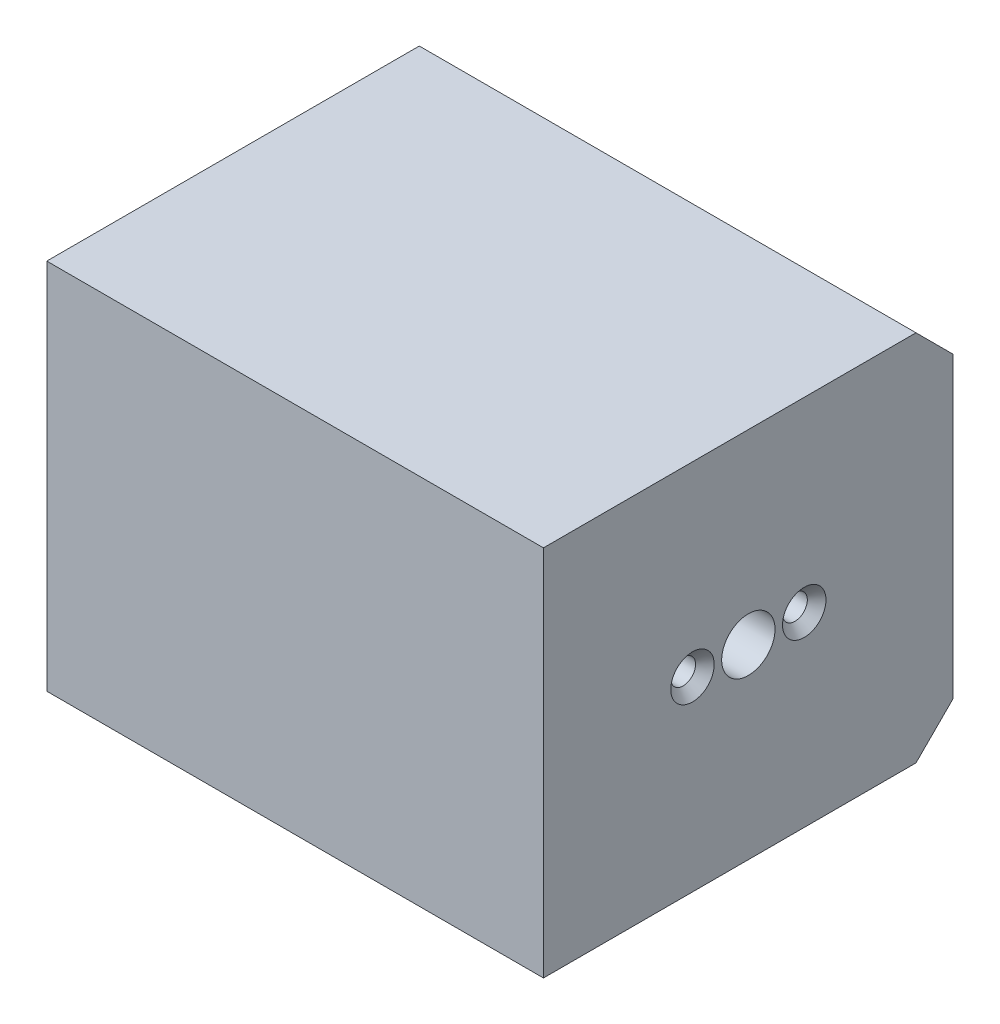
ISO-10303-21;
HEADER;
FILE_DESCRIPTION(('STEP AP214'),'2;1');
FILE_NAME('part.step','',(''),(''),'','','');
FILE_SCHEMA(('AUTOMOTIVE_DESIGN { 1 0 10303 214 1 1 1 1 }'));
ENDSEC;
DATA;
#1=APPLICATION_CONTEXT('core data for automotive mechanical design processes');
#2=APPLICATION_PROTOCOL_DEFINITION('international standard','automotive_design',2000,#1);
#3=PRODUCT_CONTEXT('',#1,'mechanical');
#4=PRODUCT('Part','Part','',(#3));
#5=PRODUCT_RELATED_PRODUCT_CATEGORY('part','',(#4));
#6=PRODUCT_DEFINITION_FORMATION('','',#4);
#7=PRODUCT_DEFINITION_CONTEXT('part definition',#1,'design');
#8=PRODUCT_DEFINITION('design','',#6,#7);
#9=PRODUCT_DEFINITION_SHAPE('','',#8);
#10=(LENGTH_UNIT() NAMED_UNIT(*) SI_UNIT(.MILLI.,.METRE.));
#11=(NAMED_UNIT(*) PLANE_ANGLE_UNIT() SI_UNIT($,.RADIAN.));
#12=(NAMED_UNIT(*) SI_UNIT($,.STERADIAN.) SOLID_ANGLE_UNIT());
#13=UNCERTAINTY_MEASURE_WITH_UNIT(LENGTH_MEASURE(1.E-05),#10,'distance_accuracy_value','');
#14=(GEOMETRIC_REPRESENTATION_CONTEXT(3) GLOBAL_UNCERTAINTY_ASSIGNED_CONTEXT((#13)) GLOBAL_UNIT_ASSIGNED_CONTEXT((#10,
#11,#12)) REPRESENTATION_CONTEXT('',''));
#15=CARTESIAN_POINT('',(0.,0.,0.));
#16=DIRECTION('',(0.,0.,1.));
#17=DIRECTION('',(1.,0.,0.));
#18=AXIS2_PLACEMENT_3D('',#15,#16,#17);
#19=CARTESIAN_POINT('',(0.,15.,-10.));
#20=DIRECTION('',(0.,-1.,0.));
#21=DIRECTION('',(0.,0.,-1.));
#22=AXIS2_PLACEMENT_3D('',#19,#20,#21);
#23=PLANE('',#22);
#24=DIRECTION('',(0.,0.,1.));
#25=VECTOR('',#24,1.);
#26=CARTESIAN_POINT('',(0.,15.,-10.));
#27=LINE('',#26,#25);
#28=CARTESIAN_POINT('',(0.,15.,-7.));
#29=VERTEX_POINT('',#28);
#30=CARTESIAN_POINT('',(0.,15.,23.));
#31=VERTEX_POINT('',#30);
#32=EDGE_CURVE('E174',#29,#31,#27,.T.);
#33=ORIENTED_EDGE('',*,*,#32,.F.);
#34=DIRECTION('',(-1.,0.,0.));
#35=VECTOR('',#34,1.);
#36=CARTESIAN_POINT('',(0.,15.,-7.));
#37=LINE('',#36,#35);
#38=CARTESIAN_POINT('',(-40.,15.,-6.99999999999999));
#39=VERTEX_POINT('',#38);
#40=EDGE_CURVE('E56',#29,#39,#37,.T.);
#41=ORIENTED_EDGE('',*,*,#40,.T.);
#42=DIRECTION('',(0.,0.,1.));
#43=VECTOR('',#42,1.);
#44=CARTESIAN_POINT('',(-40.,15.,-10.));
#45=LINE('',#44,#43);
#46=CARTESIAN_POINT('',(-40.,15.,23.));
#47=VERTEX_POINT('',#46);
#48=EDGE_CURVE('E173',#39,#47,#45,.T.);
#49=ORIENTED_EDGE('',*,*,#48,.T.);
#50=DIRECTION('',(1.,0.,0.));
#51=VECTOR('',#50,1.);
#52=CARTESIAN_POINT('',(0.,15.,23.));
#53=LINE('',#52,#51);
#54=EDGE_CURVE('E123',#47,#31,#53,.T.);
#55=ORIENTED_EDGE('',*,*,#54,.T.);
#56=EDGE_LOOP('',(#33,#41,#49,#55));
#57=FACE_BOUND('',#56,.T.);
#58=ADVANCED_FACE('F33',(#57),#23,.F.);
#59=CARTESIAN_POINT('',(0.,0.,-10.));
#60=DIRECTION('',(-1.,0.,0.));
#61=DIRECTION('',(0.,0.,1.));
#62=AXIS2_PLACEMENT_3D('',#59,#60,#61);
#63=PLANE('',#62);
#64=CARTESIAN_POINT('',(0.,0.,11.));
#65=DIRECTION('',(1.,0.,0.));
#66=DIRECTION('',(0.,0.,-1.));
#67=AXIS2_PLACEMENT_3D('',#64,#65,#66);
#68=CIRCLE('',#67,1.75);
#69=CARTESIAN_POINT('',(0.,0.,9.25));
#70=VERTEX_POINT('',#69);
#71=EDGE_CURVE('E286',#70,#70,#68,.T.);
#72=ORIENTED_EDGE('',*,*,#71,.F.);
#73=EDGE_LOOP('',(#72));
#74=FACE_BOUND('',#73,.T.);
#75=CARTESIAN_POINT('',(0.,0.,2.));
#76=DIRECTION('',(1.,0.,0.));
#77=DIRECTION('',(0.,0.,-1.));
#78=AXIS2_PLACEMENT_3D('',#75,#76,#77);
#79=CIRCLE('',#78,1.75);
#80=CARTESIAN_POINT('',(0.,0.,0.25));
#81=VERTEX_POINT('',#80);
#82=EDGE_CURVE('E190',#81,#81,#79,.T.);
#83=ORIENTED_EDGE('',*,*,#82,.F.);
#84=EDGE_LOOP('',(#83));
#85=FACE_BOUND('',#84,.T.);
#86=CARTESIAN_POINT('',(0.,0.,6.5));
#87=DIRECTION('',(-1.,0.,0.));
#88=DIRECTION('',(0.,0.,1.));
#89=AXIS2_PLACEMENT_3D('',#86,#87,#88);
#90=CIRCLE('',#89,2.15);
#91=CARTESIAN_POINT('',(0.,0.,8.65));
#92=VERTEX_POINT('',#91);
#93=EDGE_CURVE('E146',#92,#92,#90,.T.);
#94=ORIENTED_EDGE('',*,*,#93,.T.);
#95=EDGE_LOOP('',(#94));
#96=FACE_BOUND('',#95,.T.);
#97=DIRECTION('',(0.,-1.,0.));
#98=VECTOR('',#97,1.);
#99=CARTESIAN_POINT('',(0.,0.,-10.));
#100=LINE('',#99,#98);
#101=CARTESIAN_POINT('',(0.,12.,-10.));
#102=VERTEX_POINT('',#101);
#103=CARTESIAN_POINT('',(0.,-12.,-10.));
#104=VERTEX_POINT('',#103);
#105=EDGE_CURVE('E170',#102,#104,#100,.T.);
#106=ORIENTED_EDGE('',*,*,#105,.F.);
#107=DIRECTION('',(0.,-0.707106781186547,-0.707106781186548));
#108=VECTOR('',#107,1.);
#109=CARTESIAN_POINT('',(0.,12.,-10.));
#110=LINE('',#109,#108);
#111=EDGE_CURVE('E198',#102,#29,#110,.F.);
#112=ORIENTED_EDGE('',*,*,#111,.T.);
#113=ORIENTED_EDGE('',*,*,#32,.T.);
#114=DIRECTION('',(0.,-1.,0.));
#115=VECTOR('',#114,1.);
#116=CARTESIAN_POINT('',(0.,0.,23.));
#117=LINE('',#116,#115);
#118=CARTESIAN_POINT('',(0.,-15.,23.));
#119=VERTEX_POINT('',#118);
#120=EDGE_CURVE('E165',#31,#119,#117,.T.);
#121=ORIENTED_EDGE('',*,*,#120,.T.);
#122=DIRECTION('',(0.,0.,1.));
#123=VECTOR('',#122,1.);
#124=CARTESIAN_POINT('',(0.,-15.,-10.));
#125=LINE('',#124,#123);
#126=CARTESIAN_POINT('',(0.,-15.,-7.));
#127=VERTEX_POINT('',#126);
#128=EDGE_CURVE('E177',#127,#119,#125,.T.);
#129=ORIENTED_EDGE('',*,*,#128,.F.);
#130=DIRECTION('',(0.,0.707106781186548,-0.707106781186547));
#131=VECTOR('',#130,1.);
#132=CARTESIAN_POINT('',(0.,-15.,-7.));
#133=LINE('',#132,#131);
#134=EDGE_CURVE('E196',#127,#104,#133,.T.);
#135=ORIENTED_EDGE('',*,*,#134,.T.);
#136=EDGE_LOOP('',(#106,#112,#113,#121,#129,#135));
#137=FACE_BOUND('',#136,.T.);
#138=ADVANCED_FACE('F213',(#74,#85,#96,#137),#63,.F.);
#139=CARTESIAN_POINT('',(0.,-15.,-10.));
#140=DIRECTION('',(0.,-1.,0.));
#141=DIRECTION('',(0.,0.,-1.));
#142=AXIS2_PLACEMENT_3D('',#139,#140,#141);
#143=PLANE('',#142);
#144=DIRECTION('',(0.,0.,1.));
#145=VECTOR('',#144,1.);
#146=CARTESIAN_POINT('',(-40.,-15.,-10.));
#147=LINE('',#146,#145);
#148=CARTESIAN_POINT('',(-40.,-15.,-7.));
#149=VERTEX_POINT('',#148);
#150=CARTESIAN_POINT('',(-40.,-15.,23.));
#151=VERTEX_POINT('',#150);
#152=EDGE_CURVE('E179',#149,#151,#147,.T.);
#153=ORIENTED_EDGE('',*,*,#152,.F.);
#154=DIRECTION('',(1.,0.,0.));
#155=VECTOR('',#154,1.);
#156=CARTESIAN_POINT('',(0.,-15.,-7.));
#157=LINE('',#156,#155);
#158=EDGE_CURVE('E11',#149,#127,#157,.T.);
#159=ORIENTED_EDGE('',*,*,#158,.T.);
#160=ORIENTED_EDGE('',*,*,#128,.T.);
#161=DIRECTION('',(1.,0.,0.));
#162=VECTOR('',#161,1.);
#163=CARTESIAN_POINT('',(0.,-15.,23.));
#164=LINE('',#163,#162);
#165=EDGE_CURVE('E162',#151,#119,#164,.T.);
#166=ORIENTED_EDGE('',*,*,#165,.F.);
#167=EDGE_LOOP('',(#153,#159,#160,#166));
#168=FACE_BOUND('',#167,.T.);
#169=ADVANCED_FACE('F221',(#168),#143,.T.);
#170=CARTESIAN_POINT('',(-40.,0.,-10.));
#171=DIRECTION('',(-1.,0.,0.));
#172=DIRECTION('',(0.,0.,1.));
#173=AXIS2_PLACEMENT_3D('',#170,#171,#172);
#174=PLANE('',#173);
#175=DIRECTION('',(0.,-1.,0.));
#176=VECTOR('',#175,1.);
#177=CARTESIAN_POINT('',(-40.,0.,13.));
#178=LINE('',#177,#176);
#179=CARTESIAN_POINT('',(-40.,5.5,13.));
#180=VERTEX_POINT('',#179);
#181=CARTESIAN_POINT('',(-40.,-5.5,13.));
#182=VERTEX_POINT('',#181);
#183=EDGE_CURVE('E137',#180,#182,#178,.T.);
#184=ORIENTED_EDGE('',*,*,#183,.T.);
#185=DIRECTION('',(0.,0.,-1.));
#186=VECTOR('',#185,1.);
#187=CARTESIAN_POINT('',(-40.,-5.5,13.));
#188=LINE('',#187,#186);
#189=CARTESIAN_POINT('',(-40.,-5.5,0.));
#190=VERTEX_POINT('',#189);
#191=EDGE_CURVE('E153',#182,#190,#188,.T.);
#192=ORIENTED_EDGE('',*,*,#191,.T.);
#193=DIRECTION('',(0.,-1.,0.));
#194=VECTOR('',#193,1.);
#195=CARTESIAN_POINT('',(-40.,0.,0.));
#196=LINE('',#195,#194);
#197=CARTESIAN_POINT('',(-40.,5.5,0.));
#198=VERTEX_POINT('',#197);
#199=EDGE_CURVE('E148',#198,#190,#196,.T.);
#200=ORIENTED_EDGE('',*,*,#199,.F.);
#201=DIRECTION('',(0.,0.,-1.));
#202=VECTOR('',#201,1.);
#203=CARTESIAN_POINT('',(-40.,5.5,13.));
#204=LINE('',#203,#202);
#205=EDGE_CURVE('E124',#180,#198,#204,.T.);
#206=ORIENTED_EDGE('',*,*,#205,.F.);
#207=EDGE_LOOP('',(#184,#192,#200,#206));
#208=FACE_BOUND('',#207,.T.);
#209=ORIENTED_EDGE('',*,*,#48,.F.);
#210=DIRECTION('',(0.,0.707106781186547,0.707106781186548));
#211=VECTOR('',#210,1.);
#212=CARTESIAN_POINT('',(-40.,6.00000000000002,-16.));
#213=LINE('',#212,#211);
#214=CARTESIAN_POINT('',(-40.,12.,-10.));
#215=VERTEX_POINT('',#214);
#216=EDGE_CURVE('E41',#39,#215,#213,.F.);
#217=ORIENTED_EDGE('',*,*,#216,.T.);
#218=DIRECTION('',(0.,-1.,0.));
#219=VECTOR('',#218,1.);
#220=CARTESIAN_POINT('',(-40.,0.,-10.));
#221=LINE('',#220,#219);
#222=CARTESIAN_POINT('',(-40.,-12.,-10.));
#223=VERTEX_POINT('',#222);
#224=EDGE_CURVE('E168',#215,#223,#221,.T.);
#225=ORIENTED_EDGE('',*,*,#224,.T.);
#226=DIRECTION('',(0.,-0.707106781186548,0.707106781186547));
#227=VECTOR('',#226,1.);
#228=CARTESIAN_POINT('',(-40.,-5.99999999999998,-16.));
#229=LINE('',#228,#227);
#230=EDGE_CURVE('E48',#223,#149,#229,.T.);
#231=ORIENTED_EDGE('',*,*,#230,.T.);
#232=ORIENTED_EDGE('',*,*,#152,.T.);
#233=DIRECTION('',(0.,-1.,0.));
#234=VECTOR('',#233,1.);
#235=CARTESIAN_POINT('',(-40.,0.,23.));
#236=LINE('',#235,#234);
#237=EDGE_CURVE('E159',#47,#151,#236,.T.);
#238=ORIENTED_EDGE('',*,*,#237,.F.);
#239=EDGE_LOOP('',(#209,#217,#225,#231,#232,#238));
#240=FACE_BOUND('',#239,.T.);
#241=ADVANCED_FACE('F203',(#208,#240),#174,.T.);
#242=CARTESIAN_POINT('',(0.,0.,-10.));
#243=DIRECTION('',(0.,0.,1.));
#244=DIRECTION('',(1.,0.,0.));
#245=AXIS2_PLACEMENT_3D('',#242,#243,#244);
#246=PLANE('',#245);
#247=ORIENTED_EDGE('',*,*,#224,.F.);
#248=DIRECTION('',(1.,0.,0.));
#249=VECTOR('',#248,1.);
#250=CARTESIAN_POINT('',(0.,12.,-10.));
#251=LINE('',#250,#249);
#252=EDGE_CURVE('E193',#215,#102,#251,.T.);
#253=ORIENTED_EDGE('',*,*,#252,.T.);
#254=ORIENTED_EDGE('',*,*,#105,.T.);
#255=DIRECTION('',(-1.,0.,0.));
#256=VECTOR('',#255,1.);
#257=CARTESIAN_POINT('',(-40.,-12.,-10.));
#258=LINE('',#257,#256);
#259=EDGE_CURVE('E176',#104,#223,#258,.T.);
#260=ORIENTED_EDGE('',*,*,#259,.T.);
#261=EDGE_LOOP('',(#247,#253,#254,#260));
#262=FACE_BOUND('',#261,.T.);
#263=ADVANCED_FACE('F208',(#262),#246,.F.);
#264=CARTESIAN_POINT('',(0.,0.,23.));
#265=DIRECTION('',(0.,0.,1.));
#266=DIRECTION('',(1.,0.,0.));
#267=AXIS2_PLACEMENT_3D('',#264,#265,#266);
#268=PLANE('',#267);
#269=ORIENTED_EDGE('',*,*,#54,.F.);
#270=ORIENTED_EDGE('',*,*,#237,.T.);
#271=ORIENTED_EDGE('',*,*,#165,.T.);
#272=ORIENTED_EDGE('',*,*,#120,.F.);
#273=EDGE_LOOP('',(#269,#270,#271,#272));
#274=FACE_BOUND('',#273,.T.);
#275=ADVANCED_FACE('F217',(#274),#268,.T.);
#276=CARTESIAN_POINT('',(-3.4,0.,13.));
#277=DIRECTION('',(1.,0.,0.));
#278=DIRECTION('',(0.,0.,-1.));
#279=AXIS2_PLACEMENT_3D('',#276,#277,#278);
#280=PLANE('',#279);
#281=CARTESIAN_POINT('',(-3.4,0.,11.));
#282=DIRECTION('',(1.,0.,0.));
#283=DIRECTION('',(0.,0.,-1.));
#284=AXIS2_PLACEMENT_3D('',#281,#282,#283);
#285=CIRCLE('',#284,0.999999999999995);
#286=CARTESIAN_POINT('',(-3.4,0.,10.));
#287=VERTEX_POINT('',#286);
#288=EDGE_CURVE('E187',#287,#287,#285,.T.);
#289=ORIENTED_EDGE('',*,*,#288,.T.);
#290=EDGE_LOOP('',(#289));
#291=FACE_BOUND('',#290,.T.);
#292=CARTESIAN_POINT('',(-3.4,0.,2.));
#293=DIRECTION('',(1.,0.,0.));
#294=DIRECTION('',(0.,0.,-1.));
#295=AXIS2_PLACEMENT_3D('',#292,#293,#294);
#296=CIRCLE('',#295,0.999999999999995);
#297=CARTESIAN_POINT('',(-3.4,0.,1.00000000000001));
#298=VERTEX_POINT('',#297);
#299=EDGE_CURVE('E182',#298,#298,#296,.T.);
#300=ORIENTED_EDGE('',*,*,#299,.T.);
#301=EDGE_LOOP('',(#300));
#302=FACE_BOUND('',#301,.T.);
#303=CARTESIAN_POINT('',(-3.4,0.,6.5));
#304=DIRECTION('',(-1.,0.,0.));
#305=DIRECTION('',(0.,0.,1.));
#306=AXIS2_PLACEMENT_3D('',#303,#304,#305);
#307=CIRCLE('',#306,2.15);
#308=CARTESIAN_POINT('',(-3.4,0.,8.65));
#309=VERTEX_POINT('',#308);
#310=EDGE_CURVE('E185',#309,#309,#307,.T.);
#311=ORIENTED_EDGE('',*,*,#310,.F.);
#312=EDGE_LOOP('',(#311));
#313=FACE_BOUND('',#312,.T.);
#314=DIRECTION('',(0.,-1.,0.));
#315=VECTOR('',#314,1.);
#316=CARTESIAN_POINT('',(-3.4,0.,0.));
#317=LINE('',#316,#315);
#318=CARTESIAN_POINT('',(-3.4,5.5,0.));
#319=VERTEX_POINT('',#318);
#320=CARTESIAN_POINT('',(-3.4,-5.5,0.));
#321=VERTEX_POINT('',#320);
#322=EDGE_CURVE('E144',#319,#321,#317,.T.);
#323=ORIENTED_EDGE('',*,*,#322,.T.);
#324=DIRECTION('',(0.,0.,-1.));
#325=VECTOR('',#324,1.);
#326=CARTESIAN_POINT('',(-3.4,-5.5,13.));
#327=LINE('',#326,#325);
#328=CARTESIAN_POINT('',(-3.4,-5.5,13.));
#329=VERTEX_POINT('',#328);
#330=EDGE_CURVE('E130',#329,#321,#327,.T.);
#331=ORIENTED_EDGE('',*,*,#330,.F.);
#332=DIRECTION('',(0.,-1.,0.));
#333=VECTOR('',#332,1.);
#334=CARTESIAN_POINT('',(-3.4,0.,13.));
#335=LINE('',#334,#333);
#336=CARTESIAN_POINT('',(-3.4,5.5,13.));
#337=VERTEX_POINT('',#336);
#338=EDGE_CURVE('E128',#337,#329,#335,.T.);
#339=ORIENTED_EDGE('',*,*,#338,.F.);
#340=DIRECTION('',(0.,0.,-1.));
#341=VECTOR('',#340,1.);
#342=CARTESIAN_POINT('',(-3.4,5.5,13.));
#343=LINE('',#342,#341);
#344=EDGE_CURVE('E112',#337,#319,#343,.T.);
#345=ORIENTED_EDGE('',*,*,#344,.T.);
#346=EDGE_LOOP('',(#323,#331,#339,#345));
#347=FACE_BOUND('',#346,.T.);
#348=ADVANCED_FACE('F129',(#291,#302,#313,#347),#280,.F.);
#349=CARTESIAN_POINT('',(0.,5.5,13.));
#350=DIRECTION('',(0.,1.,0.));
#351=DIRECTION('',(0.,0.,1.));
#352=AXIS2_PLACEMENT_3D('',#349,#350,#351);
#353=PLANE('',#352);
#354=DIRECTION('',(1.,0.,0.));
#355=VECTOR('',#354,1.);
#356=CARTESIAN_POINT('',(0.,5.5,0.));
#357=LINE('',#356,#355);
#358=EDGE_CURVE('E119',#198,#319,#357,.T.);
#359=ORIENTED_EDGE('',*,*,#358,.T.);
#360=ORIENTED_EDGE('',*,*,#344,.F.);
#361=DIRECTION('',(1.,0.,0.));
#362=VECTOR('',#361,1.);
#363=CARTESIAN_POINT('',(0.,5.5,13.));
#364=LINE('',#363,#362);
#365=EDGE_CURVE('E117',#180,#337,#364,.T.);
#366=ORIENTED_EDGE('',*,*,#365,.F.);
#367=ORIENTED_EDGE('',*,*,#205,.T.);
#368=EDGE_LOOP('',(#359,#360,#366,#367));
#369=FACE_BOUND('',#368,.T.);
#370=ADVANCED_FACE('F114',(#369),#353,.F.);
#371=CARTESIAN_POINT('',(0.,-5.5,13.));
#372=DIRECTION('',(0.,1.,0.));
#373=DIRECTION('',(0.,0.,1.));
#374=AXIS2_PLACEMENT_3D('',#371,#372,#373);
#375=PLANE('',#374);
#376=DIRECTION('',(1.,0.,0.));
#377=VECTOR('',#376,1.);
#378=CARTESIAN_POINT('',(0.,-5.5,0.));
#379=LINE('',#378,#377);
#380=EDGE_CURVE('E133',#190,#321,#379,.T.);
#381=ORIENTED_EDGE('',*,*,#380,.F.);
#382=ORIENTED_EDGE('',*,*,#191,.F.);
#383=DIRECTION('',(1.,0.,0.));
#384=VECTOR('',#383,1.);
#385=CARTESIAN_POINT('',(0.,-5.5,13.));
#386=LINE('',#385,#384);
#387=EDGE_CURVE('E139',#182,#329,#386,.T.);
#388=ORIENTED_EDGE('',*,*,#387,.T.);
#389=ORIENTED_EDGE('',*,*,#330,.T.);
#390=EDGE_LOOP('',(#381,#382,#388,#389));
#391=FACE_BOUND('',#390,.T.);
#392=ADVANCED_FACE('F251',(#391),#375,.T.);
#393=CARTESIAN_POINT('',(0.,0.,13.));
#394=DIRECTION('',(0.,0.,1.));
#395=DIRECTION('',(1.,0.,0.));
#396=AXIS2_PLACEMENT_3D('',#393,#394,#395);
#397=PLANE('',#396);
#398=ORIENTED_EDGE('',*,*,#338,.T.);
#399=ORIENTED_EDGE('',*,*,#387,.F.);
#400=ORIENTED_EDGE('',*,*,#183,.F.);
#401=ORIENTED_EDGE('',*,*,#365,.T.);
#402=EDGE_LOOP('',(#398,#399,#400,#401));
#403=FACE_BOUND('',#402,.T.);
#404=ADVANCED_FACE('F135',(#403),#397,.F.);
#405=CARTESIAN_POINT('',(0.,0.,0.));
#406=DIRECTION('',(0.,0.,1.));
#407=DIRECTION('',(1.,0.,0.));
#408=AXIS2_PLACEMENT_3D('',#405,#406,#407);
#409=PLANE('',#408);
#410=ORIENTED_EDGE('',*,*,#322,.F.);
#411=ORIENTED_EDGE('',*,*,#358,.F.);
#412=ORIENTED_EDGE('',*,*,#199,.T.);
#413=ORIENTED_EDGE('',*,*,#380,.T.);
#414=EDGE_LOOP('',(#410,#411,#412,#413));
#415=FACE_BOUND('',#414,.T.);
#416=ADVANCED_FACE('F255',(#415),#409,.T.);
#417=CARTESIAN_POINT('',(0.,0.,6.5));
#418=DIRECTION('',(-1.,0.,0.));
#419=DIRECTION('',(0.,0.,1.));
#420=AXIS2_PLACEMENT_3D('',#417,#418,#419);
#421=CYLINDRICAL_SURFACE('',#420,2.15);
#422=ORIENTED_EDGE('',*,*,#93,.F.);
#423=EDGE_LOOP('',(#422));
#424=FACE_BOUND('',#423,.T.);
#425=ORIENTED_EDGE('',*,*,#310,.T.);
#426=EDGE_LOOP('',(#425));
#427=FACE_BOUND('',#426,.T.);
#428=ADVANCED_FACE('F258',(#424,#427),#421,.F.);
#429=CARTESIAN_POINT('',(0.,0.,2.));
#430=DIRECTION('',(1.,0.,0.));
#431=DIRECTION('',(0.,0.,-1.));
#432=AXIS2_PLACEMENT_3D('',#429,#430,#431);
#433=CYLINDRICAL_SURFACE('',#432,0.999999999999995);
#434=CARTESIAN_POINT('',(-0.750000000000008,0.,2.));
#435=DIRECTION('',(1.,0.,0.));
#436=DIRECTION('',(0.,0.,-1.));
#437=AXIS2_PLACEMENT_3D('',#434,#435,#436);
#438=CIRCLE('',#437,0.999999999999997);
#439=CARTESIAN_POINT('',(-0.750000000000008,0.,1.));
#440=VERTEX_POINT('',#439);
#441=EDGE_CURVE('E186',#440,#440,#438,.T.);
#442=ORIENTED_EDGE('',*,*,#441,.T.);
#443=EDGE_LOOP('',(#442));
#444=FACE_BOUND('',#443,.T.);
#445=ORIENTED_EDGE('',*,*,#299,.F.);
#446=EDGE_LOOP('',(#445));
#447=FACE_BOUND('',#446,.T.);
#448=ADVANCED_FACE('F264',(#444,#447),#433,.F.);
#449=CARTESIAN_POINT('',(0.,0.,2.));
#450=DIRECTION('',(1.,0.,0.));
#451=DIRECTION('',(0.,0.,-1.));
#452=AXIS2_PLACEMENT_3D('',#449,#450,#451);
#453=CONICAL_SURFACE('',#452,1.75,0.785398163397445);
#454=ORIENTED_EDGE('',*,*,#441,.F.);
#455=EDGE_LOOP('',(#454));
#456=FACE_BOUND('',#455,.T.);
#457=ORIENTED_EDGE('',*,*,#82,.T.);
#458=EDGE_LOOP('',(#457));
#459=FACE_BOUND('',#458,.T.);
#460=ADVANCED_FACE('F268',(#456,#459),#453,.F.);
#461=CARTESIAN_POINT('',(0.,0.,11.));
#462=DIRECTION('',(1.,0.,0.));
#463=DIRECTION('',(0.,0.,-1.));
#464=AXIS2_PLACEMENT_3D('',#461,#462,#463);
#465=CYLINDRICAL_SURFACE('',#464,0.999999999999995);
#466=CARTESIAN_POINT('',(-0.750000000000008,0.,11.));
#467=DIRECTION('',(1.,0.,0.));
#468=DIRECTION('',(0.,0.,-1.));
#469=AXIS2_PLACEMENT_3D('',#466,#467,#468);
#470=CIRCLE('',#469,0.999999999999997);
#471=CARTESIAN_POINT('',(-0.750000000000008,0.,10.));
#472=VERTEX_POINT('',#471);
#473=EDGE_CURVE('E191',#472,#472,#470,.T.);
#474=ORIENTED_EDGE('',*,*,#473,.T.);
#475=EDGE_LOOP('',(#474));
#476=FACE_BOUND('',#475,.T.);
#477=ORIENTED_EDGE('',*,*,#288,.F.);
#478=EDGE_LOOP('',(#477));
#479=FACE_BOUND('',#478,.T.);
#480=ADVANCED_FACE('F272',(#476,#479),#465,.F.);
#481=CARTESIAN_POINT('',(0.,0.,11.));
#482=DIRECTION('',(1.,0.,0.));
#483=DIRECTION('',(0.,0.,-1.));
#484=AXIS2_PLACEMENT_3D('',#481,#482,#483);
#485=CONICAL_SURFACE('',#484,1.75,0.785398163397445);
#486=ORIENTED_EDGE('',*,*,#473,.F.);
#487=EDGE_LOOP('',(#486));
#488=FACE_BOUND('',#487,.T.);
#489=ORIENTED_EDGE('',*,*,#71,.T.);
#490=EDGE_LOOP('',(#489));
#491=FACE_BOUND('',#490,.T.);
#492=ADVANCED_FACE('F228',(#488,#491),#485,.F.);
#493=CARTESIAN_POINT('',(0.,12.,-10.));
#494=DIRECTION('',(0.,-0.707106781186548,0.707106781186547));
#495=DIRECTION('',(1.,0.,0.));
#496=AXIS2_PLACEMENT_3D('',#493,#494,#495);
#497=PLANE('',#496);
#498=ORIENTED_EDGE('',*,*,#216,.F.);
#499=ORIENTED_EDGE('',*,*,#40,.F.);
#500=ORIENTED_EDGE('',*,*,#111,.F.);
#501=ORIENTED_EDGE('',*,*,#252,.F.);
#502=EDGE_LOOP('',(#498,#499,#500,#501));
#503=FACE_BOUND('',#502,.T.);
#504=ADVANCED_FACE('F211',(#503),#497,.F.);
#505=CARTESIAN_POINT('',(0.,-15.,-7.));
#506=DIRECTION('',(0.,-0.707106781186547,-0.707106781186548));
#507=DIRECTION('',(-1.,0.,0.));
#508=AXIS2_PLACEMENT_3D('',#505,#506,#507);
#509=PLANE('',#508);
#510=ORIENTED_EDGE('',*,*,#230,.F.);
#511=ORIENTED_EDGE('',*,*,#259,.F.);
#512=ORIENTED_EDGE('',*,*,#134,.F.);
#513=ORIENTED_EDGE('',*,*,#158,.F.);
#514=EDGE_LOOP('',(#510,#511,#512,#513));
#515=FACE_BOUND('',#514,.T.);
#516=ADVANCED_FACE('F35',(#515),#509,.T.);
#517=CLOSED_SHELL('',(#58,#138,#169,#241,#263,#275,#348,#370,#392,#404,#416,#428,#448,#460,#480,
#492,#504,#516));
#518=MANIFOLD_SOLID_BREP('B2',#517);
#519=ADVANCED_BREP_SHAPE_REPRESENTATION('',(#18,#518),#14);
#520=SHAPE_DEFINITION_REPRESENTATION(#9,#519);
ENDSEC;
END-ISO-10303-21;
